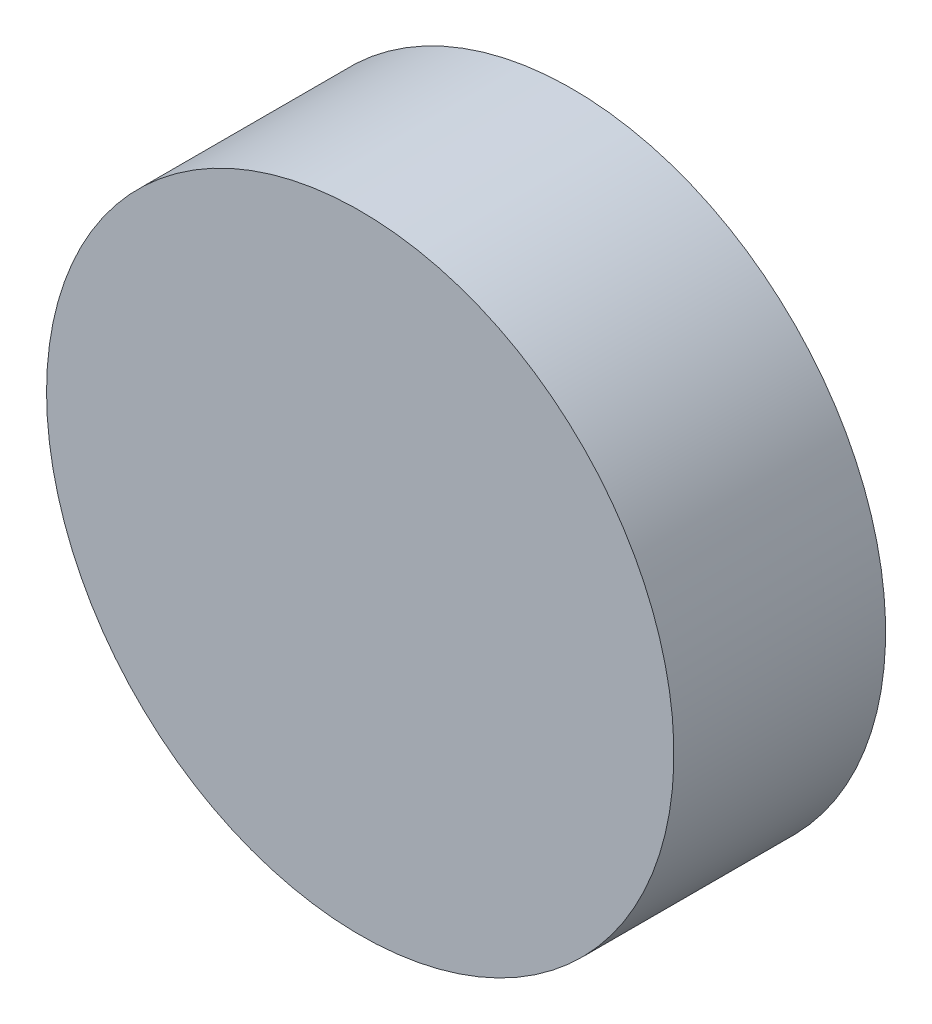
ISO-10303-21;
HEADER;
FILE_DESCRIPTION(('STEP AP214'),'2;1');
FILE_NAME('part.step','',(''),(''),'','','');
FILE_SCHEMA(('AUTOMOTIVE_DESIGN { 1 0 10303 214 1 1 1 1 }'));
ENDSEC;
DATA;
#1=APPLICATION_CONTEXT('core data for automotive mechanical design processes');
#2=APPLICATION_PROTOCOL_DEFINITION('international standard','automotive_design',2000,#1);
#3=PRODUCT_CONTEXT('',#1,'mechanical');
#4=PRODUCT('Part','Part','',(#3));
#5=PRODUCT_RELATED_PRODUCT_CATEGORY('part','',(#4));
#6=PRODUCT_DEFINITION_FORMATION('','',#4);
#7=PRODUCT_DEFINITION_CONTEXT('part definition',#1,'design');
#8=PRODUCT_DEFINITION('design','',#6,#7);
#9=PRODUCT_DEFINITION_SHAPE('','',#8);
#10=(LENGTH_UNIT() NAMED_UNIT(*) SI_UNIT(.MILLI.,.METRE.));
#11=(NAMED_UNIT(*) PLANE_ANGLE_UNIT() SI_UNIT($,.RADIAN.));
#12=(NAMED_UNIT(*) SI_UNIT($,.STERADIAN.) SOLID_ANGLE_UNIT());
#13=UNCERTAINTY_MEASURE_WITH_UNIT(LENGTH_MEASURE(1.E-05),#10,'distance_accuracy_value','');
#14=(GEOMETRIC_REPRESENTATION_CONTEXT(3) GLOBAL_UNCERTAINTY_ASSIGNED_CONTEXT((#13)) GLOBAL_UNIT_ASSIGNED_CONTEXT((#10,
#11,#12)) REPRESENTATION_CONTEXT('',''));
#15=CARTESIAN_POINT('',(0.,0.,0.));
#16=DIRECTION('',(0.,0.,1.));
#17=DIRECTION('',(1.,0.,0.));
#18=AXIS2_PLACEMENT_3D('',#15,#16,#17);
#19=CARTESIAN_POINT('',(0.,0.,1.35));
#20=DIRECTION('',(0.,0.,-1.));
#21=DIRECTION('',(-1.,0.,0.));
#22=AXIS2_PLACEMENT_3D('',#19,#20,#21);
#23=CYLINDRICAL_SURFACE('',#22,2.);
#24=CARTESIAN_POINT('',(0.,0.,1.35));
#25=DIRECTION('',(0.,0.,1.));
#26=DIRECTION('',(1.,0.,0.));
#27=AXIS2_PLACEMENT_3D('',#24,#25,#26);
#28=CIRCLE('',#27,2.);
#29=CARTESIAN_POINT('',(-2.,0.,1.35));
#30=VERTEX_POINT('',#29);
#31=EDGE_CURVE('E10',#30,#30,#28,.T.);
#32=CARTESIAN_POINT('',(0.,0.,0.));
#33=DIRECTION('',(0.,0.,1.));
#34=DIRECTION('',(1.,0.,0.));
#35=AXIS2_PLACEMENT_3D('',#32,#33,#34);
#36=CIRCLE('',#35,2.);
#37=CARTESIAN_POINT('',(-2.,0.,0.));
#38=VERTEX_POINT('',#37);
#39=EDGE_CURVE('E40',#38,#38,#36,.T.);
#40=CARTESIAN_POINT('',(-2.,0.,1.35));
#41=CARTESIAN_POINT('',(-2.,0.,1.3359375));
#42=CARTESIAN_POINT('',(-2.,0.,1.321875));
#43=CARTESIAN_POINT('',(-2.,0.,1.29375));
#44=CARTESIAN_POINT('',(-2.,0.,1.2796875));
#45=CARTESIAN_POINT('',(-2.,0.,1.2515625));
#46=CARTESIAN_POINT('',(-2.,0.,1.2375));
#47=CARTESIAN_POINT('',(-2.,0.,1.209375));
#48=CARTESIAN_POINT('',(-2.,0.,1.1953125));
#49=CARTESIAN_POINT('',(-2.,0.,1.1671875));
#50=CARTESIAN_POINT('',(-2.,0.,1.153125));
#51=CARTESIAN_POINT('',(-2.,0.,1.125));
#52=CARTESIAN_POINT('',(-2.,0.,1.1109375));
#53=CARTESIAN_POINT('',(-2.,0.,1.0828125));
#54=CARTESIAN_POINT('',(-2.,0.,1.06875));
#55=CARTESIAN_POINT('',(-2.,0.,1.040625));
#56=CARTESIAN_POINT('',(-2.,0.,1.0265625));
#57=CARTESIAN_POINT('',(-2.,0.,0.9984375));
#58=CARTESIAN_POINT('',(-2.,0.,0.984375));
#59=CARTESIAN_POINT('',(-2.,0.,0.95625));
#60=CARTESIAN_POINT('',(-2.,0.,0.9421875));
#61=CARTESIAN_POINT('',(-2.,0.,0.9140625));
#62=CARTESIAN_POINT('',(-2.,0.,0.9));
#63=CARTESIAN_POINT('',(-2.,0.,0.871875));
#64=CARTESIAN_POINT('',(-2.,0.,0.8578125));
#65=CARTESIAN_POINT('',(-2.,0.,0.8296875));
#66=CARTESIAN_POINT('',(-2.,0.,0.815625));
#67=CARTESIAN_POINT('',(-2.,0.,0.7875));
#68=CARTESIAN_POINT('',(-2.,0.,0.7734375));
#69=CARTESIAN_POINT('',(-2.,0.,0.7453125));
#70=CARTESIAN_POINT('',(-2.,0.,0.73125));
#71=CARTESIAN_POINT('',(-2.,0.,0.703125));
#72=CARTESIAN_POINT('',(-2.,0.,0.6890625));
#73=CARTESIAN_POINT('',(-2.,0.,0.6609375));
#74=CARTESIAN_POINT('',(-2.,0.,0.646875));
#75=CARTESIAN_POINT('',(-2.,0.,0.61875));
#76=CARTESIAN_POINT('',(-2.,0.,0.6046875));
#77=CARTESIAN_POINT('',(-2.,0.,0.5765625));
#78=CARTESIAN_POINT('',(-2.,0.,0.5625));
#79=CARTESIAN_POINT('',(-2.,0.,0.534375));
#80=CARTESIAN_POINT('',(-2.,0.,0.5203125));
#81=CARTESIAN_POINT('',(-2.,0.,0.4921875));
#82=CARTESIAN_POINT('',(-2.,0.,0.478125));
#83=CARTESIAN_POINT('',(-2.,0.,0.45));
#84=CARTESIAN_POINT('',(-2.,0.,0.4359375));
#85=CARTESIAN_POINT('',(-2.,0.,0.4078125));
#86=CARTESIAN_POINT('',(-2.,0.,0.39375));
#87=CARTESIAN_POINT('',(-2.,0.,0.365625));
#88=CARTESIAN_POINT('',(-2.,0.,0.3515625));
#89=CARTESIAN_POINT('',(-2.,0.,0.3234375));
#90=CARTESIAN_POINT('',(-2.,0.,0.309375));
#91=CARTESIAN_POINT('',(-2.,0.,0.28125));
#92=CARTESIAN_POINT('',(-2.,0.,0.2671875));
#93=CARTESIAN_POINT('',(-2.,0.,0.2390625));
#94=CARTESIAN_POINT('',(-2.,0.,0.225));
#95=CARTESIAN_POINT('',(-2.,0.,0.196875));
#96=CARTESIAN_POINT('',(-2.,0.,0.1828125));
#97=CARTESIAN_POINT('',(-2.,0.,0.1546875));
#98=CARTESIAN_POINT('',(-2.,0.,0.140625));
#99=CARTESIAN_POINT('',(-2.,0.,0.1125));
#100=CARTESIAN_POINT('',(-2.,0.,0.0984374999999998));
#101=CARTESIAN_POINT('',(-2.,0.,0.0703124999999998));
#102=CARTESIAN_POINT('',(-2.,0.,0.0562499999999999));
#103=CARTESIAN_POINT('',(-2.,0.,0.0281249999999999));
#104=CARTESIAN_POINT('',(-2.,0.,0.0140624999999998));
#105=CARTESIAN_POINT('',(-2.,0.,0.));
#106=B_SPLINE_CURVE_WITH_KNOTS('',3,(#40,#41,#42,#43,#44,#45,#46,#47,#48,#49,#50,#51,#52,#53,
#54,#55,#56,#57,#58,#59,#60,#61,#62,#63,#64,#65,#66,#67,#68,#69,#70,#71,#72,#73,#74,#75,#76,#77,
#78,#79,#80,#81,#82,#83,#84,#85,#86,#87,#88,#89,#90,#91,#92,#93,#94,#95,#96,#97,#98,#99,#100,
#101,#102,#103,#104,#105),.UNSPECIFIED.,.F.,.F.,(4,2,2,2,2,2,2,2,2,2,2,2,2,2,2,2,2,2,2,2,2,2,2,
2,2,2,2,2,2,2,2,2,4),(0.,0.0421875000000001,0.084375,0.1265625,0.16875,0.2109375,0.253125,
0.2953125,0.3375,0.3796875,0.421875,0.4640625,0.50625,0.5484375,0.590625,0.6328125,0.675,
0.7171875,0.759375,0.8015625,0.84375,0.8859375,0.928125,0.9703125,1.0125,1.0546875,1.096875,
1.1390625,1.18125,1.2234375,1.265625,1.3078125,1.35),.UNSPECIFIED.);
#107=EDGE_CURVE('BSEAM37',#30,#38,#106,.T.);
#108=ORIENTED_EDGE('',*,*,#31,.F.);
#109=ORIENTED_EDGE('',*,*,#39,.T.);
#110=ORIENTED_EDGE('',*,*,#107,.T.);
#111=ORIENTED_EDGE('',*,*,#107,.F.);
#112=EDGE_LOOP('',(#108,#110,#109,#111));
#113=FACE_BOUND('',#112,.T.);
#114=ADVANCED_FACE('F37',(#113),#23,.T.);
#115=CARTESIAN_POINT('',(0.,0.,1.35));
#116=DIRECTION('',(0.,0.,1.));
#117=DIRECTION('',(1.,0.,0.));
#118=AXIS2_PLACEMENT_3D('',#115,#116,#117);
#119=PLANE('',#118);
#120=ORIENTED_EDGE('',*,*,#31,.T.);
#121=EDGE_LOOP('',(#120));
#122=FACE_BOUND('',#121,.T.);
#123=ADVANCED_FACE('F54',(#122),#119,.T.);
#124=CARTESIAN_POINT('',(0.,0.,0.));
#125=DIRECTION('',(0.,0.,1.));
#126=DIRECTION('',(1.,0.,0.));
#127=AXIS2_PLACEMENT_3D('',#124,#125,#126);
#128=PLANE('',#127);
#129=ORIENTED_EDGE('',*,*,#39,.F.);
#130=EDGE_LOOP('',(#129));
#131=FACE_BOUND('',#130,.T.);
#132=ADVANCED_FACE('F52',(#131),#128,.F.);
#133=CLOSED_SHELL('',(#114,#123,#132));
#134=MANIFOLD_SOLID_BREP('B2',#133);
#135=ADVANCED_BREP_SHAPE_REPRESENTATION('',(#18,#134),#14);
#136=SHAPE_DEFINITION_REPRESENTATION(#9,#135);
ENDSEC;
END-ISO-10303-21;
